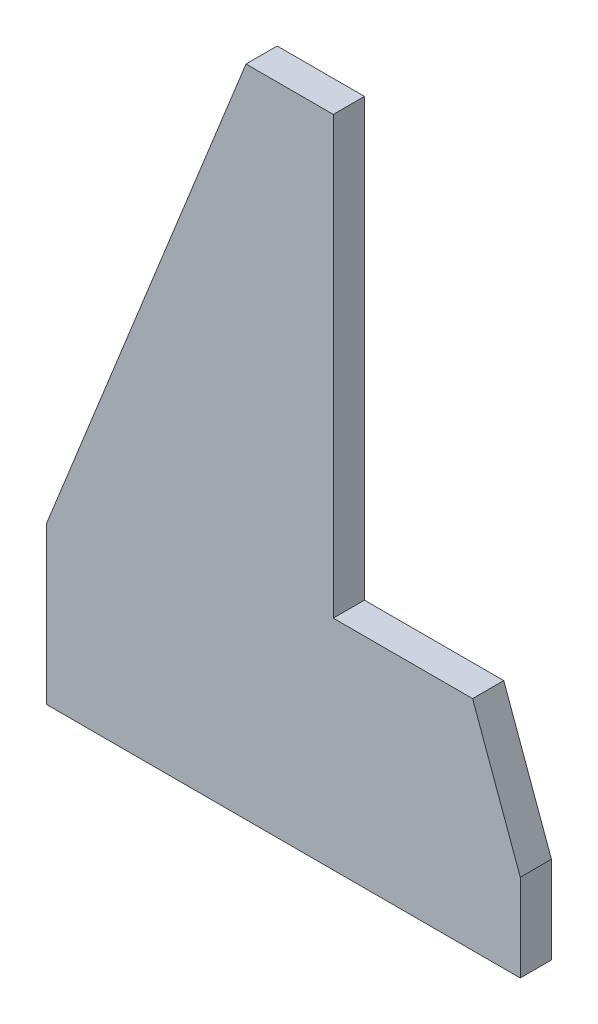
ISO-10303-21;
HEADER;
FILE_DESCRIPTION(('STEP AP214'),'2;1');
FILE_NAME('part.step','',(''),(''),'','','');
FILE_SCHEMA(('AUTOMOTIVE_DESIGN { 1 0 10303 214 1 1 1 1 }'));
ENDSEC;
DATA;
#1=APPLICATION_CONTEXT('core data for automotive mechanical design processes');
#2=APPLICATION_PROTOCOL_DEFINITION('international standard','automotive_design',2000,#1);
#3=PRODUCT_CONTEXT('',#1,'mechanical');
#4=PRODUCT('Part','Part','',(#3));
#5=PRODUCT_RELATED_PRODUCT_CATEGORY('part','',(#4));
#6=PRODUCT_DEFINITION_FORMATION('','',#4);
#7=PRODUCT_DEFINITION_CONTEXT('part definition',#1,'design');
#8=PRODUCT_DEFINITION('design','',#6,#7);
#9=PRODUCT_DEFINITION_SHAPE('','',#8);
#10=(LENGTH_UNIT() NAMED_UNIT(*) SI_UNIT(.MILLI.,.METRE.));
#11=(NAMED_UNIT(*) PLANE_ANGLE_UNIT() SI_UNIT($,.RADIAN.));
#12=(NAMED_UNIT(*) SI_UNIT($,.STERADIAN.) SOLID_ANGLE_UNIT());
#13=UNCERTAINTY_MEASURE_WITH_UNIT(LENGTH_MEASURE(1.E-05),#10,'distance_accuracy_value','');
#14=(GEOMETRIC_REPRESENTATION_CONTEXT(3) GLOBAL_UNCERTAINTY_ASSIGNED_CONTEXT((#13)) GLOBAL_UNIT_ASSIGNED_CONTEXT((#10,
#11,#12)) REPRESENTATION_CONTEXT('',''));
#15=CARTESIAN_POINT('',(0.,0.,0.));
#16=DIRECTION('',(0.,0.,1.));
#17=DIRECTION('',(1.,0.,0.));
#18=AXIS2_PLACEMENT_3D('',#15,#16,#17);
#19=CARTESIAN_POINT('',(-210.,0.,10.));
#20=DIRECTION('',(0.,1.,0.));
#21=DIRECTION('',(0.,0.,1.));
#22=AXIS2_PLACEMENT_3D('',#19,#20,#21);
#23=PLANE('',#22);
#24=DIRECTION('',(1.,0.,0.));
#25=VECTOR('',#24,1.);
#26=CARTESIAN_POINT('',(-210.,0.,10.));
#27=LINE('',#26,#25);
#28=CARTESIAN_POINT('',(-152.,0.,10.));
#29=VERTEX_POINT('',#28);
#30=CARTESIAN_POINT('',(0.,0.,10.));
#31=VERTEX_POINT('',#30);
#32=EDGE_CURVE('E88',#29,#31,#27,.T.);
#33=ORIENTED_EDGE('',*,*,#32,.F.);
#34=DIRECTION('',(0.,0.,-1.));
#35=VECTOR('',#34,1.);
#36=CARTESIAN_POINT('',(-152.,0.,10.));
#37=LINE('',#36,#35);
#38=CARTESIAN_POINT('',(-152.,0.,0.));
#39=VERTEX_POINT('',#38);
#40=EDGE_CURVE('E126',#29,#39,#37,.T.);
#41=ORIENTED_EDGE('',*,*,#40,.T.);
#42=DIRECTION('',(1.,0.,0.));
#43=VECTOR('',#42,1.);
#44=CARTESIAN_POINT('',(-210.,0.,0.));
#45=LINE('',#44,#43);
#46=CARTESIAN_POINT('',(0.,0.,0.));
#47=VERTEX_POINT('',#46);
#48=EDGE_CURVE('E123',#39,#47,#45,.T.);
#49=ORIENTED_EDGE('',*,*,#48,.T.);
#50=DIRECTION('',(0.,0.,-1.));
#51=VECTOR('',#50,1.);
#52=CARTESIAN_POINT('',(0.,0.,10.));
#53=LINE('',#52,#51);
#54=EDGE_CURVE('E11',#31,#47,#53,.T.);
#55=ORIENTED_EDGE('',*,*,#54,.F.);
#56=EDGE_LOOP('',(#33,#41,#49,#55));
#57=FACE_BOUND('',#56,.T.);
#58=ADVANCED_FACE('F33',(#57),#23,.F.);
#59=CARTESIAN_POINT('',(0.,0.,10.));
#60=DIRECTION('',(-1.,0.,0.));
#61=DIRECTION('',(0.,0.,1.));
#62=AXIS2_PLACEMENT_3D('',#59,#60,#61);
#63=PLANE('',#62);
#64=DIRECTION('',(0.,1.,0.));
#65=VECTOR('',#64,1.);
#66=CARTESIAN_POINT('',(0.,0.,0.));
#67=LINE('',#66,#65);
#68=CARTESIAN_POINT('',(0.,28.,0.));
#69=VERTEX_POINT('',#68);
#70=EDGE_CURVE('E125',#47,#69,#67,.T.);
#71=ORIENTED_EDGE('',*,*,#70,.T.);
#72=DIRECTION('',(0.,0.,-1.));
#73=VECTOR('',#72,1.);
#74=CARTESIAN_POINT('',(0.,28.,10.));
#75=LINE('',#74,#73);
#76=CARTESIAN_POINT('',(0.,28.,10.));
#77=VERTEX_POINT('',#76);
#78=EDGE_CURVE('E41',#77,#69,#75,.T.);
#79=ORIENTED_EDGE('',*,*,#78,.F.);
#80=DIRECTION('',(0.,1.,0.));
#81=VECTOR('',#80,1.);
#82=CARTESIAN_POINT('',(0.,0.,10.));
#83=LINE('',#82,#81);
#84=EDGE_CURVE('E102',#31,#77,#83,.T.);
#85=ORIENTED_EDGE('',*,*,#84,.F.);
#86=ORIENTED_EDGE('',*,*,#54,.T.);
#87=EDGE_LOOP('',(#71,#79,#85,#86));
#88=FACE_BOUND('',#87,.T.);
#89=ADVANCED_FACE('F179',(#88),#63,.F.);
#90=CARTESIAN_POINT('',(0.,28.,10.));
#91=DIRECTION('',(-0.939597315436241,-0.342281879194631,0.));
#92=DIRECTION('',(0.342281879194631,-0.939597315436242,0.));
#93=AXIS2_PLACEMENT_3D('',#90,#91,#92);
#94=PLANE('',#93);
#95=DIRECTION('',(-0.342281879194631,0.939597315436241,0.));
#96=VECTOR('',#95,1.);
#97=CARTESIAN_POINT('',(0.,28.,0.));
#98=LINE('',#97,#96);
#99=CARTESIAN_POINT('',(-15.3,70.,0.));
#100=VERTEX_POINT('',#99);
#101=EDGE_CURVE('E111',#69,#100,#98,.T.);
#102=ORIENTED_EDGE('',*,*,#101,.T.);
#103=DIRECTION('',(0.,0.,-1.));
#104=VECTOR('',#103,1.);
#105=CARTESIAN_POINT('',(-15.3,70.,10.));
#106=LINE('',#105,#104);
#107=CARTESIAN_POINT('',(-15.3,70.,10.));
#108=VERTEX_POINT('',#107);
#109=EDGE_CURVE('E108',#108,#100,#106,.T.);
#110=ORIENTED_EDGE('',*,*,#109,.F.);
#111=DIRECTION('',(-0.342281879194631,0.939597315436241,0.));
#112=VECTOR('',#111,1.);
#113=CARTESIAN_POINT('',(0.,28.,10.));
#114=LINE('',#113,#112);
#115=EDGE_CURVE('E95',#77,#108,#114,.T.);
#116=ORIENTED_EDGE('',*,*,#115,.F.);
#117=ORIENTED_EDGE('',*,*,#78,.T.);
#118=EDGE_LOOP('',(#102,#110,#116,#117));
#119=FACE_BOUND('',#118,.T.);
#120=ADVANCED_FACE('F109',(#119),#94,.F.);
#121=CARTESIAN_POINT('',(-15.3,70.,10.));
#122=DIRECTION('',(0.,-1.,0.));
#123=DIRECTION('',(1.,0.,0.));
#124=AXIS2_PLACEMENT_3D('',#121,#122,#123);
#125=PLANE('',#124);
#126=DIRECTION('',(-1.,0.,0.));
#127=VECTOR('',#126,1.);
#128=CARTESIAN_POINT('',(-15.3,70.,0.));
#129=LINE('',#128,#127);
#130=CARTESIAN_POINT('',(-60.,70.,0.));
#131=VERTEX_POINT('',#130);
#132=EDGE_CURVE('E129',#100,#131,#129,.T.);
#133=ORIENTED_EDGE('',*,*,#132,.T.);
#134=DIRECTION('',(0.,0.,-1.));
#135=VECTOR('',#134,1.);
#136=CARTESIAN_POINT('',(-60.,70.,10.));
#137=LINE('',#136,#135);
#138=CARTESIAN_POINT('',(-60.,70.,10.));
#139=VERTEX_POINT('',#138);
#140=EDGE_CURVE('E114',#139,#131,#137,.T.);
#141=ORIENTED_EDGE('',*,*,#140,.F.);
#142=DIRECTION('',(-1.,0.,0.));
#143=VECTOR('',#142,1.);
#144=CARTESIAN_POINT('',(-15.3,70.,10.));
#145=LINE('',#144,#143);
#146=EDGE_CURVE('E99',#108,#139,#145,.T.);
#147=ORIENTED_EDGE('',*,*,#146,.F.);
#148=ORIENTED_EDGE('',*,*,#109,.T.);
#149=EDGE_LOOP('',(#133,#141,#147,#148));
#150=FACE_BOUND('',#149,.T.);
#151=ADVANCED_FACE('F116',(#150),#125,.F.);
#152=CARTESIAN_POINT('',(-60.,70.,10.));
#153=DIRECTION('',(-1.,0.,0.));
#154=DIRECTION('',(0.,-1.,0.));
#155=AXIS2_PLACEMENT_3D('',#152,#153,#154);
#156=PLANE('',#155);
#157=DIRECTION('',(0.,1.,0.));
#158=VECTOR('',#157,1.);
#159=CARTESIAN_POINT('',(-60.,70.,0.));
#160=LINE('',#159,#158);
#161=CARTESIAN_POINT('',(-60.,210.,0.));
#162=VERTEX_POINT('',#161);
#163=EDGE_CURVE('E72',#131,#162,#160,.T.);
#164=ORIENTED_EDGE('',*,*,#163,.T.);
#165=DIRECTION('',(0.,0.,-1.));
#166=VECTOR('',#165,1.);
#167=CARTESIAN_POINT('',(-60.,210.,10.));
#168=LINE('',#167,#166);
#169=CARTESIAN_POINT('',(-60.,210.,10.));
#170=VERTEX_POINT('',#169);
#171=EDGE_CURVE('E136',#170,#162,#168,.T.);
#172=ORIENTED_EDGE('',*,*,#171,.F.);
#173=DIRECTION('',(0.,1.,0.));
#174=VECTOR('',#173,1.);
#175=CARTESIAN_POINT('',(-60.,70.,10.));
#176=LINE('',#175,#174);
#177=EDGE_CURVE('E49',#139,#170,#176,.T.);
#178=ORIENTED_EDGE('',*,*,#177,.F.);
#179=ORIENTED_EDGE('',*,*,#140,.T.);
#180=EDGE_LOOP('',(#164,#172,#178,#179));
#181=FACE_BOUND('',#180,.T.);
#182=ADVANCED_FACE('F144',(#181),#156,.F.);
#183=CARTESIAN_POINT('',(-60.,210.,10.));
#184=DIRECTION('',(0.,-1.,0.));
#185=DIRECTION('',(0.,0.,-1.));
#186=AXIS2_PLACEMENT_3D('',#183,#184,#185);
#187=PLANE('',#186);
#188=DIRECTION('',(-1.,0.,0.));
#189=VECTOR('',#188,1.);
#190=CARTESIAN_POINT('',(-60.,210.,0.));
#191=LINE('',#190,#189);
#192=CARTESIAN_POINT('',(-88.,210.,0.));
#193=VERTEX_POINT('',#192);
#194=EDGE_CURVE('E132',#162,#193,#191,.T.);
#195=ORIENTED_EDGE('',*,*,#194,.T.);
#196=DIRECTION('',(0.,0.,-1.));
#197=VECTOR('',#196,1.);
#198=CARTESIAN_POINT('',(-88.,210.,10.));
#199=LINE('',#198,#197);
#200=CARTESIAN_POINT('',(-88.,210.,10.));
#201=VERTEX_POINT('',#200);
#202=EDGE_CURVE('E80',#201,#193,#199,.T.);
#203=ORIENTED_EDGE('',*,*,#202,.F.);
#204=DIRECTION('',(-1.,0.,0.));
#205=VECTOR('',#204,1.);
#206=CARTESIAN_POINT('',(-60.,210.,10.));
#207=LINE('',#206,#205);
#208=EDGE_CURVE('E118',#170,#201,#207,.T.);
#209=ORIENTED_EDGE('',*,*,#208,.F.);
#210=ORIENTED_EDGE('',*,*,#171,.T.);
#211=EDGE_LOOP('',(#195,#203,#209,#210));
#212=FACE_BOUND('',#211,.T.);
#213=ADVANCED_FACE('F147',(#212),#187,.F.);
#214=CARTESIAN_POINT('',(0.,0.,10.));
#215=DIRECTION('',(0.,0.,1.));
#216=DIRECTION('',(1.,0.,0.));
#217=AXIS2_PLACEMENT_3D('',#214,#215,#216);
#218=PLANE('',#217);
#219=DIRECTION('',(0.,-1.,0.));
#220=VECTOR('',#219,1.);
#221=CARTESIAN_POINT('',(-152.,50.3471377678785,10.));
#222=LINE('',#221,#220);
#223=CARTESIAN_POINT('',(-152.,50.3471377678785,10.));
#224=VERTEX_POINT('',#223);
#225=EDGE_CURVE('E167',#224,#29,#222,.T.);
#226=ORIENTED_EDGE('',*,*,#225,.T.);
#227=ORIENTED_EDGE('',*,*,#32,.T.);
#228=ORIENTED_EDGE('',*,*,#84,.T.);
#229=ORIENTED_EDGE('',*,*,#115,.T.);
#230=ORIENTED_EDGE('',*,*,#146,.T.);
#231=ORIENTED_EDGE('',*,*,#177,.T.);
#232=ORIENTED_EDGE('',*,*,#208,.T.);
#233=DIRECTION('',(-0.372086505643039,-0.928198056622806,0.));
#234=VECTOR('',#233,1.);
#235=CARTESIAN_POINT('',(-88.,210.,10.));
#236=LINE('',#235,#234);
#237=EDGE_CURVE('E151',#201,#224,#236,.T.);
#238=ORIENTED_EDGE('',*,*,#237,.T.);
#239=EDGE_LOOP('',(#226,#227,#228,#229,#230,#231,#232,#238));
#240=FACE_BOUND('',#239,.T.);
#241=ADVANCED_FACE('F97',(#240),#218,.T.);
#242=CARTESIAN_POINT('',(0.,0.,0.));
#243=DIRECTION('',(0.,0.,1.));
#244=DIRECTION('',(1.,0.,0.));
#245=AXIS2_PLACEMENT_3D('',#242,#243,#244);
#246=PLANE('',#245);
#247=ORIENTED_EDGE('',*,*,#48,.F.);
#248=DIRECTION('',(0.,-1.,0.));
#249=VECTOR('',#248,1.);
#250=CARTESIAN_POINT('',(-152.,50.3471377678785,0.));
#251=LINE('',#250,#249);
#252=CARTESIAN_POINT('',(-152.,50.3471377678785,0.));
#253=VERTEX_POINT('',#252);
#254=EDGE_CURVE('E163',#253,#39,#251,.T.);
#255=ORIENTED_EDGE('',*,*,#254,.F.);
#256=DIRECTION('',(-0.372086505643039,-0.928198056622806,0.));
#257=VECTOR('',#256,1.);
#258=CARTESIAN_POINT('',(-88.,210.,0.));
#259=LINE('',#258,#257);
#260=EDGE_CURVE('E176',#193,#253,#259,.T.);
#261=ORIENTED_EDGE('',*,*,#260,.F.);
#262=ORIENTED_EDGE('',*,*,#194,.F.);
#263=ORIENTED_EDGE('',*,*,#163,.F.);
#264=ORIENTED_EDGE('',*,*,#132,.F.);
#265=ORIENTED_EDGE('',*,*,#101,.F.);
#266=ORIENTED_EDGE('',*,*,#70,.F.);
#267=EDGE_LOOP('',(#247,#255,#261,#262,#263,#264,#265,#266));
#268=FACE_BOUND('',#267,.T.);
#269=ADVANCED_FACE('F142',(#268),#246,.F.);
#270=CARTESIAN_POINT('',(-152.,50.3471377678785,10.));
#271=DIRECTION('',(1.,0.,0.));
#272=DIRECTION('',(0.,0.,-1.));
#273=AXIS2_PLACEMENT_3D('',#270,#271,#272);
#274=PLANE('',#273);
#275=ORIENTED_EDGE('',*,*,#225,.F.);
#276=DIRECTION('',(0.,0.,-1.));
#277=VECTOR('',#276,1.);
#278=CARTESIAN_POINT('',(-152.,50.3471377678785,10.));
#279=LINE('',#278,#277);
#280=EDGE_CURVE('E169',#224,#253,#279,.T.);
#281=ORIENTED_EDGE('',*,*,#280,.T.);
#282=ORIENTED_EDGE('',*,*,#254,.T.);
#283=ORIENTED_EDGE('',*,*,#40,.F.);
#284=EDGE_LOOP('',(#275,#281,#282,#283));
#285=FACE_BOUND('',#284,.T.);
#286=ADVANCED_FACE('F166',(#285),#274,.F.);
#287=CARTESIAN_POINT('',(-88.,210.,10.));
#288=DIRECTION('',(0.928198056622806,-0.372086505643039,0.));
#289=DIRECTION('',(0.372086505643039,0.928198056622806,0.));
#290=AXIS2_PLACEMENT_3D('',#287,#288,#289);
#291=PLANE('',#290);
#292=ORIENTED_EDGE('',*,*,#260,.T.);
#293=ORIENTED_EDGE('',*,*,#280,.F.);
#294=ORIENTED_EDGE('',*,*,#237,.F.);
#295=ORIENTED_EDGE('',*,*,#202,.T.);
#296=EDGE_LOOP('',(#292,#293,#294,#295));
#297=FACE_BOUND('',#296,.T.);
#298=ADVANCED_FACE('F178',(#297),#291,.F.);
#299=CLOSED_SHELL('',(#58,#89,#120,#151,#182,#213,#241,#269,#286,#298));
#300=MANIFOLD_SOLID_BREP('B2',#299);
#301=ADVANCED_BREP_SHAPE_REPRESENTATION('',(#18,#300),#14);
#302=SHAPE_DEFINITION_REPRESENTATION(#9,#301);
ENDSEC;
END-ISO-10303-21;
